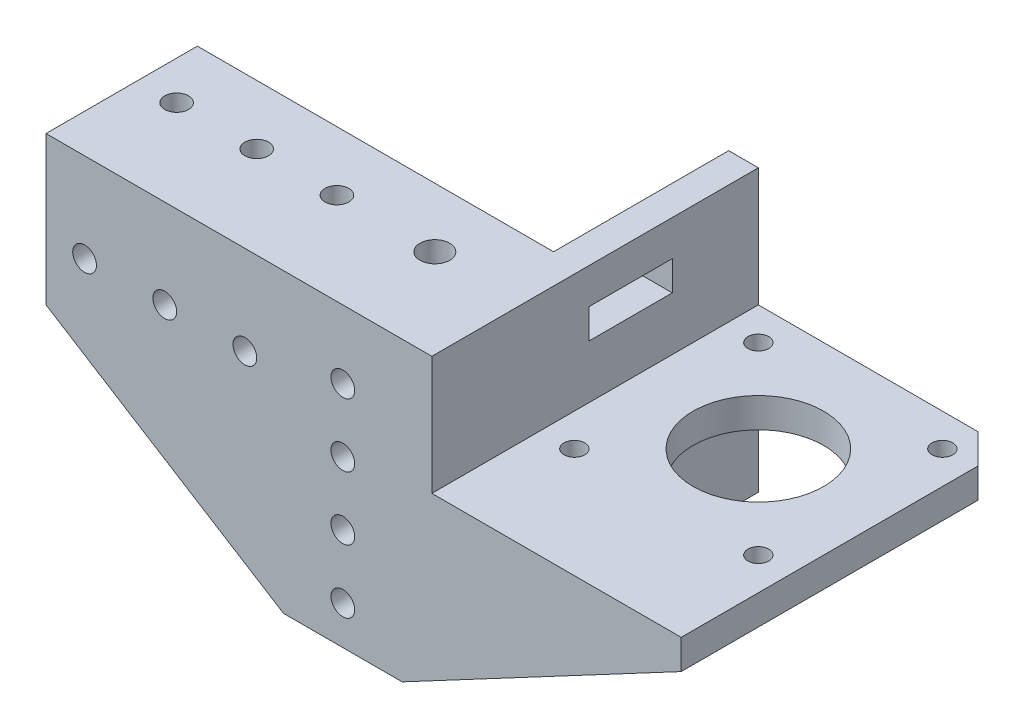
ISO-10303-21;
HEADER;
FILE_DESCRIPTION(('STEP AP214'),'2;1');
FILE_NAME('part.step','',(''),(''),'','','');
FILE_SCHEMA(('AUTOMOTIVE_DESIGN { 1 0 10303 214 1 1 1 1 }'));
ENDSEC;
DATA;
#1=APPLICATION_CONTEXT('core data for automotive mechanical design processes');
#2=APPLICATION_PROTOCOL_DEFINITION('international standard','automotive_design',2000,#1);
#3=PRODUCT_CONTEXT('',#1,'mechanical');
#4=PRODUCT('Part','Part','',(#3));
#5=PRODUCT_RELATED_PRODUCT_CATEGORY('part','',(#4));
#6=PRODUCT_DEFINITION_FORMATION('','',#4);
#7=PRODUCT_DEFINITION_CONTEXT('part definition',#1,'design');
#8=PRODUCT_DEFINITION('design','',#6,#7);
#9=PRODUCT_DEFINITION_SHAPE('','',#8);
#10=(LENGTH_UNIT() NAMED_UNIT(*) SI_UNIT(.MILLI.,.METRE.));
#11=(NAMED_UNIT(*) PLANE_ANGLE_UNIT() SI_UNIT($,.RADIAN.));
#12=(NAMED_UNIT(*) SI_UNIT($,.STERADIAN.) SOLID_ANGLE_UNIT());
#13=UNCERTAINTY_MEASURE_WITH_UNIT(LENGTH_MEASURE(1.E-05),#10,'distance_accuracy_value','');
#14=(GEOMETRIC_REPRESENTATION_CONTEXT(3) GLOBAL_UNCERTAINTY_ASSIGNED_CONTEXT((#13)) GLOBAL_UNIT_ASSIGNED_CONTEXT((#10,
#11,#12)) REPRESENTATION_CONTEXT('',''));
#15=CARTESIAN_POINT('',(0.,0.,0.));
#16=DIRECTION('',(0.,0.,1.));
#17=DIRECTION('',(1.,0.,0.));
#18=AXIS2_PLACEMENT_3D('',#15,#16,#17);
#19=CARTESIAN_POINT('',(0.,25.,0.));
#20=DIRECTION('',(0.,-1.,0.));
#21=DIRECTION('',(0.,0.,-1.));
#22=AXIS2_PLACEMENT_3D('',#19,#20,#21);
#23=PLANE('',#22);
#24=CARTESIAN_POINT('',(10.,25.,-10.));
#25=DIRECTION('',(0.,1.,0.));
#26=DIRECTION('',(0.,0.,1.));
#27=AXIS2_PLACEMENT_3D('',#24,#25,#26);
#28=CIRCLE('',#27,2.5);
#29=CARTESIAN_POINT('',(10.,25.,-7.5));
#30=VERTEX_POINT('',#29);
#31=EDGE_CURVE('E264',#30,#30,#28,.T.);
#32=ORIENTED_EDGE('',*,*,#31,.F.);
#33=EDGE_LOOP('',(#32));
#34=FACE_BOUND('',#33,.T.);
#35=CARTESIAN_POINT('',(-33.5,25.,-10.));
#36=DIRECTION('',(0.,1.,0.));
#37=DIRECTION('',(0.,0.,1.));
#38=AXIS2_PLACEMENT_3D('',#35,#36,#37);
#39=CIRCLE('',#38,2.);
#40=CARTESIAN_POINT('',(-33.5,25.,-7.99999999999999));
#41=VERTEX_POINT('',#40);
#42=EDGE_CURVE('E268',#41,#41,#39,.T.);
#43=ORIENTED_EDGE('',*,*,#42,.F.);
#44=EDGE_LOOP('',(#43));
#45=FACE_BOUND('',#44,.T.);
#46=CARTESIAN_POINT('',(-20.,25.,-10.));
#47=DIRECTION('',(0.,1.,0.));
#48=DIRECTION('',(0.,0.,1.));
#49=AXIS2_PLACEMENT_3D('',#46,#47,#48);
#50=CIRCLE('',#49,2.);
#51=CARTESIAN_POINT('',(-20.,25.,-8.));
#52=VERTEX_POINT('',#51);
#53=EDGE_CURVE('E271',#52,#52,#50,.T.);
#54=ORIENTED_EDGE('',*,*,#53,.F.);
#55=EDGE_LOOP('',(#54));
#56=FACE_BOUND('',#55,.T.);
#57=CARTESIAN_POINT('',(-6.49999999999998,25.,-10.));
#58=DIRECTION('',(0.,1.,0.));
#59=DIRECTION('',(0.,0.,1.));
#60=AXIS2_PLACEMENT_3D('',#57,#58,#59);
#61=CIRCLE('',#60,2.);
#62=CARTESIAN_POINT('',(-6.49999999999998,25.,-8.));
#63=VERTEX_POINT('',#62);
#64=EDGE_CURVE('E263',#63,#63,#61,.T.);
#65=ORIENTED_EDGE('',*,*,#64,.F.);
#66=EDGE_LOOP('',(#65));
#67=FACE_BOUND('',#66,.T.);
#68=DIRECTION('',(0.,0.,1.));
#69=VECTOR('',#68,1.);
#70=CARTESIAN_POINT('',(25.,25.,-49.5));
#71=LINE('',#70,#69);
#72=CARTESIAN_POINT('',(25.,25.,-49.5));
#73=VERTEX_POINT('',#72);
#74=CARTESIAN_POINT('',(25.,25.,5.5));
#75=VERTEX_POINT('',#74);
#76=EDGE_CURVE('E285',#73,#75,#71,.T.);
#77=ORIENTED_EDGE('',*,*,#76,.F.);
#78=DIRECTION('',(-1.,0.,0.));
#79=VECTOR('',#78,1.);
#80=CARTESIAN_POINT('',(30.,25.,-49.5));
#81=LINE('',#80,#79);
#82=CARTESIAN_POINT('',(20.,25.,-49.5));
#83=VERTEX_POINT('',#82);
#84=EDGE_CURVE('E332',#73,#83,#81,.T.);
#85=ORIENTED_EDGE('',*,*,#84,.T.);
#86=DIRECTION('',(0.,0.,-1.));
#87=VECTOR('',#86,1.);
#88=CARTESIAN_POINT('',(20.,25.,-49.5));
#89=LINE('',#88,#87);
#90=CARTESIAN_POINT('',(20.,25.,-20.));
#91=VERTEX_POINT('',#90);
#92=EDGE_CURVE('E288',#91,#83,#89,.T.);
#93=ORIENTED_EDGE('',*,*,#92,.F.);
#94=DIRECTION('',(-1.,0.,0.));
#95=VECTOR('',#94,1.);
#96=CARTESIAN_POINT('',(-40.,25.,-20.));
#97=LINE('',#96,#95);
#98=CARTESIAN_POINT('',(-40.,25.,-20.));
#99=VERTEX_POINT('',#98);
#100=EDGE_CURVE('E344',#91,#99,#97,.T.);
#101=ORIENTED_EDGE('',*,*,#100,.T.);
#102=DIRECTION('',(0.,0.,1.));
#103=VECTOR('',#102,1.);
#104=CARTESIAN_POINT('',(-40.,25.,5.5));
#105=LINE('',#104,#103);
#106=CARTESIAN_POINT('',(-40.,25.,5.5));
#107=VERTEX_POINT('',#106);
#108=EDGE_CURVE('E337',#99,#107,#105,.T.);
#109=ORIENTED_EDGE('',*,*,#108,.T.);
#110=DIRECTION('',(1.,0.,0.));
#111=VECTOR('',#110,1.);
#112=CARTESIAN_POINT('',(-40.,25.,5.5));
#113=LINE('',#112,#111);
#114=EDGE_CURVE('E340',#107,#75,#113,.T.);
#115=ORIENTED_EDGE('',*,*,#114,.T.);
#116=EDGE_LOOP('',(#77,#85,#93,#101,#109,#115));
#117=FACE_BOUND('',#116,.T.);
#118=ADVANCED_FACE('F34',(#34,#45,#56,#67,#117),#23,.F.);
#119=CARTESIAN_POINT('',(-40.,25.,-20.));
#120=DIRECTION('',(0.,0.,1.));
#121=DIRECTION('',(1.,0.,0.));
#122=AXIS2_PLACEMENT_3D('',#119,#120,#121);
#123=PLANE('',#122);
#124=DIRECTION('',(0.,-1.,0.));
#125=VECTOR('',#124,1.);
#126=CARTESIAN_POINT('',(20.,54.9207286007544,-20.));
#127=LINE('',#126,#125);
#128=CARTESIAN_POINT('',(20.,20.,-20.));
#129=VERTEX_POINT('',#128);
#130=EDGE_CURVE('E287',#91,#129,#127,.T.);
#131=ORIENTED_EDGE('',*,*,#130,.T.);
#132=DIRECTION('',(-1.,0.,0.));
#133=VECTOR('',#132,1.);
#134=CARTESIAN_POINT('',(-40.,20.,-20.));
#135=LINE('',#134,#133);
#136=CARTESIAN_POINT('',(-40.,20.,-20.));
#137=VERTEX_POINT('',#136);
#138=EDGE_CURVE('E341',#129,#137,#135,.T.);
#139=ORIENTED_EDGE('',*,*,#138,.T.);
#140=DIRECTION('',(0.,-1.,0.));
#141=VECTOR('',#140,1.);
#142=CARTESIAN_POINT('',(-40.,25.,-20.));
#143=LINE('',#142,#141);
#144=EDGE_CURVE('E346',#99,#137,#143,.T.);
#145=ORIENTED_EDGE('',*,*,#144,.F.);
#146=ORIENTED_EDGE('',*,*,#100,.F.);
#147=EDGE_LOOP('',(#131,#139,#145,#146));
#148=FACE_BOUND('',#147,.T.);
#149=ADVANCED_FACE('F480',(#148),#123,.F.);
#150=CARTESIAN_POINT('',(0.,20.,0.));
#151=DIRECTION('',(0.,-1.,0.));
#152=DIRECTION('',(0.,0.,-1.));
#153=AXIS2_PLACEMENT_3D('',#150,#151,#152);
#154=PLANE('',#153);
#155=CARTESIAN_POINT('',(10.,20.,-10.));
#156=DIRECTION('',(0.,-1.,0.));
#157=DIRECTION('',(0.,0.,-1.));
#158=AXIS2_PLACEMENT_3D('',#155,#156,#157);
#159=CIRCLE('',#158,2.5);
#160=CARTESIAN_POINT('',(10.,20.,-12.5));
#161=VERTEX_POINT('',#160);
#162=EDGE_CURVE('E280',#161,#161,#159,.T.);
#163=ORIENTED_EDGE('',*,*,#162,.F.);
#164=EDGE_LOOP('',(#163));
#165=FACE_BOUND('',#164,.T.);
#166=CARTESIAN_POINT('',(-33.5,20.,-10.));
#167=DIRECTION('',(0.,-1.,0.));
#168=DIRECTION('',(0.,0.,-1.));
#169=AXIS2_PLACEMENT_3D('',#166,#167,#168);
#170=CIRCLE('',#169,2.);
#171=CARTESIAN_POINT('',(-33.5,20.,-12.));
#172=VERTEX_POINT('',#171);
#173=EDGE_CURVE('E390',#172,#172,#170,.T.);
#174=ORIENTED_EDGE('',*,*,#173,.F.);
#175=EDGE_LOOP('',(#174));
#176=FACE_BOUND('',#175,.T.);
#177=CARTESIAN_POINT('',(-20.,20.,-10.));
#178=DIRECTION('',(0.,-1.,0.));
#179=DIRECTION('',(0.,0.,-1.));
#180=AXIS2_PLACEMENT_3D('',#177,#178,#179);
#181=CIRCLE('',#180,2.);
#182=CARTESIAN_POINT('',(-20.,20.,-12.));
#183=VERTEX_POINT('',#182);
#184=EDGE_CURVE('E387',#183,#183,#181,.T.);
#185=ORIENTED_EDGE('',*,*,#184,.F.);
#186=EDGE_LOOP('',(#185));
#187=FACE_BOUND('',#186,.T.);
#188=CARTESIAN_POINT('',(-6.49999999999998,20.,-10.));
#189=DIRECTION('',(0.,-1.,0.));
#190=DIRECTION('',(0.,0.,-1.));
#191=AXIS2_PLACEMENT_3D('',#188,#189,#190);
#192=CIRCLE('',#191,2.);
#193=CARTESIAN_POINT('',(-6.49999999999998,20.,-12.));
#194=VERTEX_POINT('',#193);
#195=EDGE_CURVE('E267',#194,#194,#192,.T.);
#196=ORIENTED_EDGE('',*,*,#195,.F.);
#197=EDGE_LOOP('',(#196));
#198=FACE_BOUND('',#197,.T.);
#199=ORIENTED_EDGE('',*,*,#138,.F.);
#200=DIRECTION('',(0.,0.,1.));
#201=VECTOR('',#200,1.);
#202=CARTESIAN_POINT('',(20.,20.,-7.5));
#203=LINE('',#202,#201);
#204=CARTESIAN_POINT('',(20.,20.,0.));
#205=VERTEX_POINT('',#204);
#206=EDGE_CURVE('E310',#129,#205,#203,.T.);
#207=ORIENTED_EDGE('',*,*,#206,.T.);
#208=DIRECTION('',(1.,0.,0.));
#209=VECTOR('',#208,1.);
#210=CARTESIAN_POINT('',(0.,20.,0.));
#211=LINE('',#210,#209);
#212=CARTESIAN_POINT('',(-40.,20.,0.));
#213=VERTEX_POINT('',#212);
#214=EDGE_CURVE('E366',#213,#205,#211,.T.);
#215=ORIENTED_EDGE('',*,*,#214,.F.);
#216=DIRECTION('',(0.,0.,1.));
#217=VECTOR('',#216,1.);
#218=CARTESIAN_POINT('',(-40.,20.,5.5));
#219=LINE('',#218,#217);
#220=EDGE_CURVE('E336',#137,#213,#219,.T.);
#221=ORIENTED_EDGE('',*,*,#220,.F.);
#222=EDGE_LOOP('',(#199,#207,#215,#221));
#223=FACE_BOUND('',#222,.T.);
#224=ADVANCED_FACE('F472',(#165,#176,#187,#198,#223),#154,.T.);
#225=CARTESIAN_POINT('',(0.,0.,-7.5));
#226=DIRECTION('',(0.,0.,-1.));
#227=DIRECTION('',(-1.,0.,0.));
#228=AXIS2_PLACEMENT_3D('',#225,#226,#227);
#229=PLANE('',#228);
#230=DIRECTION('',(-0.88287238919928,-0.46961297297834,0.));
#231=VECTOR('',#230,1.);
#232=CARTESIAN_POINT('',(67.,0.,-7.5));
#233=LINE('',#232,#231);
#234=CARTESIAN_POINT('',(67.,0.,-7.5));
#235=VERTEX_POINT('',#234);
#236=CARTESIAN_POINT('',(25.,-22.3404255319149,-7.5));
#237=VERTEX_POINT('',#236);
#238=EDGE_CURVE('E305',#235,#237,#233,.T.);
#239=ORIENTED_EDGE('',*,*,#238,.T.);
#240=DIRECTION('',(0.,1.,0.));
#241=VECTOR('',#240,1.);
#242=CARTESIAN_POINT('',(25.,0.,-7.5));
#243=LINE('',#242,#241);
#244=CARTESIAN_POINT('',(25.,0.,-7.5));
#245=VERTEX_POINT('',#244);
#246=EDGE_CURVE('E382',#237,#245,#243,.T.);
#247=ORIENTED_EDGE('',*,*,#246,.T.);
#248=DIRECTION('',(1.,0.,0.));
#249=VECTOR('',#248,1.);
#250=CARTESIAN_POINT('',(25.,0.,-7.5));
#251=LINE('',#250,#249);
#252=EDGE_CURVE('E307',#245,#235,#251,.T.);
#253=ORIENTED_EDGE('',*,*,#252,.T.);
#254=EDGE_LOOP('',(#239,#247,#253));
#255=FACE_BOUND('',#254,.T.);
#256=ADVANCED_FACE('F469',(#255),#229,.T.);
#257=CARTESIAN_POINT('',(0.,0.,0.));
#258=DIRECTION('',(0.,0.,1.));
#259=DIRECTION('',(1.,0.,0.));
#260=AXIS2_PLACEMENT_3D('',#257,#258,#259);
#261=PLANE('',#260);
#262=CARTESIAN_POINT('',(-33.5,10.,0.));
#263=DIRECTION('',(0.,0.,1.));
#264=DIRECTION('',(1.,0.,0.));
#265=AXIS2_PLACEMENT_3D('',#262,#263,#264);
#266=CIRCLE('',#265,2.);
#267=CARTESIAN_POINT('',(-31.5,10.,0.));
#268=VERTEX_POINT('',#267);
#269=EDGE_CURVE('E260',#268,#268,#266,.T.);
#270=ORIENTED_EDGE('',*,*,#269,.T.);
#271=EDGE_LOOP('',(#270));
#272=FACE_BOUND('',#271,.T.);
#273=CARTESIAN_POINT('',(10.,13.5,0.));
#274=DIRECTION('',(0.,0.,1.));
#275=DIRECTION('',(1.,0.,0.));
#276=AXIS2_PLACEMENT_3D('',#273,#274,#275);
#277=CIRCLE('',#276,2.);
#278=CARTESIAN_POINT('',(12.,13.5,0.));
#279=VERTEX_POINT('',#278);
#280=EDGE_CURVE('E257',#279,#279,#277,.T.);
#281=ORIENTED_EDGE('',*,*,#280,.T.);
#282=EDGE_LOOP('',(#281));
#283=FACE_BOUND('',#282,.T.);
#284=CARTESIAN_POINT('',(10.,-18.5,0.));
#285=DIRECTION('',(0.,0.,1.));
#286=DIRECTION('',(1.,0.,0.));
#287=AXIS2_PLACEMENT_3D('',#284,#285,#286);
#288=CIRCLE('',#287,2.);
#289=CARTESIAN_POINT('',(12.,-18.5,0.));
#290=VERTEX_POINT('',#289);
#291=EDGE_CURVE('E254',#290,#290,#288,.T.);
#292=ORIENTED_EDGE('',*,*,#291,.T.);
#293=EDGE_LOOP('',(#292));
#294=FACE_BOUND('',#293,.T.);
#295=CARTESIAN_POINT('',(9.99999999999993,2.83333333333334,0.));
#296=DIRECTION('',(0.,0.,1.));
#297=DIRECTION('',(1.,0.,0.));
#298=AXIS2_PLACEMENT_3D('',#295,#296,#297);
#299=CIRCLE('',#298,2.);
#300=CARTESIAN_POINT('',(11.9999999999999,2.83333333333334,0.));
#301=VERTEX_POINT('',#300);
#302=EDGE_CURVE('E251',#301,#301,#299,.T.);
#303=ORIENTED_EDGE('',*,*,#302,.T.);
#304=EDGE_LOOP('',(#303));
#305=FACE_BOUND('',#304,.T.);
#306=CARTESIAN_POINT('',(9.99999999999996,-7.83333333333332,0.));
#307=DIRECTION('',(0.,0.,1.));
#308=DIRECTION('',(1.,0.,0.));
#309=AXIS2_PLACEMENT_3D('',#306,#307,#308);
#310=CIRCLE('',#309,2.);
#311=CARTESIAN_POINT('',(12.,-7.83333333333332,0.));
#312=VERTEX_POINT('',#311);
#313=EDGE_CURVE('E248',#312,#312,#310,.T.);
#314=ORIENTED_EDGE('',*,*,#313,.T.);
#315=EDGE_LOOP('',(#314));
#316=FACE_BOUND('',#315,.T.);
#317=CARTESIAN_POINT('',(-6.5,10.,0.));
#318=DIRECTION('',(0.,0.,1.));
#319=DIRECTION('',(1.,0.,0.));
#320=AXIS2_PLACEMENT_3D('',#317,#318,#319);
#321=CIRCLE('',#320,2.);
#322=CARTESIAN_POINT('',(-4.5,10.,0.));
#323=VERTEX_POINT('',#322);
#324=EDGE_CURVE('E245',#323,#323,#321,.T.);
#325=ORIENTED_EDGE('',*,*,#324,.T.);
#326=EDGE_LOOP('',(#325));
#327=FACE_BOUND('',#326,.T.);
#328=CARTESIAN_POINT('',(-20.,10.,0.));
#329=DIRECTION('',(0.,0.,1.));
#330=DIRECTION('',(1.,0.,0.));
#331=AXIS2_PLACEMENT_3D('',#328,#329,#330);
#332=CIRCLE('',#331,2.);
#333=CARTESIAN_POINT('',(-18.,10.,0.));
#334=VERTEX_POINT('',#333);
#335=EDGE_CURVE('E225',#334,#334,#332,.T.);
#336=ORIENTED_EDGE('',*,*,#335,.T.);
#337=EDGE_LOOP('',(#336));
#338=FACE_BOUND('',#337,.T.);
#339=DIRECTION('',(0.,1.,0.));
#340=VECTOR('',#339,1.);
#341=CARTESIAN_POINT('',(20.,-25.,0.));
#342=LINE('',#341,#340);
#343=CARTESIAN_POINT('',(20.,-25.,0.));
#344=VERTEX_POINT('',#343);
#345=EDGE_CURVE('E300',#344,#205,#342,.T.);
#346=ORIENTED_EDGE('',*,*,#345,.F.);
#347=DIRECTION('',(1.,0.,0.));
#348=VECTOR('',#347,1.);
#349=CARTESIAN_POINT('',(0.,-25.,0.));
#350=LINE('',#349,#348);
#351=CARTESIAN_POINT('',(0.,-25.,0.));
#352=VERTEX_POINT('',#351);
#353=EDGE_CURVE('E352',#352,#344,#350,.T.);
#354=ORIENTED_EDGE('',*,*,#353,.F.);
#355=DIRECTION('',(0.847998304005088,-0.52999894000318,0.));
#356=VECTOR('',#355,1.);
#357=CARTESIAN_POINT('',(-11.2359550561798,-17.9775280898876,0.));
#358=LINE('',#357,#356);
#359=CARTESIAN_POINT('',(-40.,0.,0.));
#360=VERTEX_POINT('',#359);
#361=EDGE_CURVE('E357',#360,#352,#358,.T.);
#362=ORIENTED_EDGE('',*,*,#361,.F.);
#363=DIRECTION('',(0.,-1.,0.));
#364=VECTOR('',#363,1.);
#365=CARTESIAN_POINT('',(-40.,0.,0.));
#366=LINE('',#365,#364);
#367=EDGE_CURVE('E369',#213,#360,#366,.T.);
#368=ORIENTED_EDGE('',*,*,#367,.F.);
#369=ORIENTED_EDGE('',*,*,#214,.T.);
#370=EDGE_LOOP('',(#346,#354,#362,#368,#369));
#371=FACE_BOUND('',#370,.T.);
#372=ADVANCED_FACE('F471',(#272,#283,#294,#305,#316,#327,#338,#371),#261,.F.);
#373=CARTESIAN_POINT('',(0.,-25.,5.5));
#374=DIRECTION('',(0.,1.,0.));
#375=DIRECTION('',(-1.,0.,0.));
#376=AXIS2_PLACEMENT_3D('',#373,#374,#375);
#377=PLANE('',#376);
#378=ORIENTED_EDGE('',*,*,#353,.T.);
#379=DIRECTION('',(0.,0.,-1.));
#380=VECTOR('',#379,1.);
#381=CARTESIAN_POINT('',(20.,-25.,5.5));
#382=LINE('',#381,#380);
#383=CARTESIAN_POINT('',(20.,-25.,5.5));
#384=VERTEX_POINT('',#383);
#385=EDGE_CURVE('E379',#384,#344,#382,.T.);
#386=ORIENTED_EDGE('',*,*,#385,.F.);
#387=DIRECTION('',(1.,0.,0.));
#388=VECTOR('',#387,1.);
#389=CARTESIAN_POINT('',(0.,-25.,5.5));
#390=LINE('',#389,#388);
#391=CARTESIAN_POINT('',(0.,-25.,5.5));
#392=VERTEX_POINT('',#391);
#393=EDGE_CURVE('E353',#392,#384,#390,.T.);
#394=ORIENTED_EDGE('',*,*,#393,.F.);
#395=DIRECTION('',(0.,0.,-1.));
#396=VECTOR('',#395,1.);
#397=CARTESIAN_POINT('',(0.,-25.,5.5));
#398=LINE('',#397,#396);
#399=EDGE_CURVE('E363',#392,#352,#398,.T.);
#400=ORIENTED_EDGE('',*,*,#399,.T.);
#401=EDGE_LOOP('',(#378,#386,#394,#400));
#402=FACE_BOUND('',#401,.T.);
#403=ADVANCED_FACE('F464',(#402),#377,.F.);
#404=CARTESIAN_POINT('',(14.7759350741002,-27.7787579393084,5.5));
#405=DIRECTION('',(-0.46961297297834,0.88287238919928,0.));
#406=DIRECTION('',(-0.88287238919928,-0.46961297297834,0.));
#407=AXIS2_PLACEMENT_3D('',#404,#405,#406);
#408=PLANE('',#407);
#409=ORIENTED_EDGE('',*,*,#385,.T.);
#410=DIRECTION('',(0.,0.,1.));
#411=VECTOR('',#410,1.);
#412=CARTESIAN_POINT('',(20.,-25.,-7.5));
#413=LINE('',#412,#411);
#414=CARTESIAN_POINT('',(20.,-25.,-49.5));
#415=VERTEX_POINT('',#414);
#416=EDGE_CURVE('E314',#415,#344,#413,.T.);
#417=ORIENTED_EDGE('',*,*,#416,.F.);
#418=DIRECTION('',(0.88287238919928,0.46961297297834,0.));
#419=VECTOR('',#418,1.);
#420=CARTESIAN_POINT('',(25.,-22.3404255319149,-49.5));
#421=LINE('',#420,#419);
#422=CARTESIAN_POINT('',(25.,-22.3404255319149,-49.5));
#423=VERTEX_POINT('',#422);
#424=EDGE_CURVE('E297',#415,#423,#421,.T.);
#425=ORIENTED_EDGE('',*,*,#424,.T.);
#426=DIRECTION('',(0.,0.,1.));
#427=VECTOR('',#426,1.);
#428=CARTESIAN_POINT('',(25.,-22.3404255319149,-94.7769256906871));
#429=LINE('',#428,#427);
#430=EDGE_CURVE('E291',#423,#237,#429,.T.);
#431=ORIENTED_EDGE('',*,*,#430,.T.);
#432=ORIENTED_EDGE('',*,*,#238,.F.);
#433=DIRECTION('',(0.,0.,-1.));
#434=VECTOR('',#433,1.);
#435=CARTESIAN_POINT('',(67.,0.,5.5));
#436=LINE('',#435,#434);
#437=CARTESIAN_POINT('',(67.,0.,5.5));
#438=VERTEX_POINT('',#437);
#439=EDGE_CURVE('E377',#438,#235,#436,.T.);
#440=ORIENTED_EDGE('',*,*,#439,.F.);
#441=DIRECTION('',(0.88287238919928,0.46961297297834,0.));
#442=VECTOR('',#441,1.);
#443=CARTESIAN_POINT('',(14.7759350741002,-27.7787579393084,5.5));
#444=LINE('',#443,#442);
#445=EDGE_CURVE('E356',#384,#438,#444,.T.);
#446=ORIENTED_EDGE('',*,*,#445,.F.);
#447=EDGE_LOOP('',(#409,#417,#425,#431,#432,#440,#446));
#448=FACE_BOUND('',#447,.T.);
#449=ADVANCED_FACE('F465',(#448),#408,.F.);
#450=CARTESIAN_POINT('',(-40.,0.,5.5));
#451=DIRECTION('',(1.,0.,0.));
#452=DIRECTION('',(0.,1.,0.));
#453=AXIS2_PLACEMENT_3D('',#450,#451,#452);
#454=PLANE('',#453);
#455=ORIENTED_EDGE('',*,*,#367,.T.);
#456=DIRECTION('',(0.,0.,-1.));
#457=VECTOR('',#456,1.);
#458=CARTESIAN_POINT('',(-40.,0.,5.5));
#459=LINE('',#458,#457);
#460=CARTESIAN_POINT('',(-40.,0.,5.5));
#461=VERTEX_POINT('',#460);
#462=EDGE_CURVE('E374',#461,#360,#459,.T.);
#463=ORIENTED_EDGE('',*,*,#462,.F.);
#464=DIRECTION('',(0.,-1.,0.));
#465=VECTOR('',#464,1.);
#466=CARTESIAN_POINT('',(-40.,0.,5.5));
#467=LINE('',#466,#465);
#468=EDGE_CURVE('E359',#107,#461,#467,.T.);
#469=ORIENTED_EDGE('',*,*,#468,.F.);
#470=ORIENTED_EDGE('',*,*,#108,.F.);
#471=ORIENTED_EDGE('',*,*,#144,.T.);
#472=ORIENTED_EDGE('',*,*,#220,.T.);
#473=EDGE_LOOP('',(#455,#463,#469,#470,#471,#472));
#474=FACE_BOUND('',#473,.T.);
#475=ADVANCED_FACE('F452',(#474),#454,.F.);
#476=CARTESIAN_POINT('',(-11.2359550561798,-17.9775280898876,5.5));
#477=DIRECTION('',(0.52999894000318,0.847998304005088,0.));
#478=DIRECTION('',(-0.847998304005088,0.52999894000318,0.));
#479=AXIS2_PLACEMENT_3D('',#476,#477,#478);
#480=PLANE('',#479);
#481=ORIENTED_EDGE('',*,*,#361,.T.);
#482=ORIENTED_EDGE('',*,*,#399,.F.);
#483=DIRECTION('',(0.847998304005088,-0.52999894000318,0.));
#484=VECTOR('',#483,1.);
#485=CARTESIAN_POINT('',(-11.2359550561798,-17.9775280898876,5.5));
#486=LINE('',#485,#484);
#487=EDGE_CURVE('E361',#461,#392,#486,.T.);
#488=ORIENTED_EDGE('',*,*,#487,.F.);
#489=ORIENTED_EDGE('',*,*,#462,.T.);
#490=EDGE_LOOP('',(#481,#482,#488,#489));
#491=FACE_BOUND('',#490,.T.);
#492=ADVANCED_FACE('F460',(#491),#480,.F.);
#493=CARTESIAN_POINT('',(0.,0.,5.5));
#494=DIRECTION('',(0.,0.,1.));
#495=DIRECTION('',(1.,0.,0.));
#496=AXIS2_PLACEMENT_3D('',#493,#494,#495);
#497=PLANE('',#496);
#498=CARTESIAN_POINT('',(-33.5,10.,5.5));
#499=DIRECTION('',(0.,0.,1.));
#500=DIRECTION('',(1.,0.,0.));
#501=AXIS2_PLACEMENT_3D('',#498,#499,#500);
#502=CIRCLE('',#501,2.);
#503=CARTESIAN_POINT('',(-31.5,10.,5.5));
#504=VERTEX_POINT('',#503);
#505=EDGE_CURVE('E222',#504,#504,#502,.T.);
#506=ORIENTED_EDGE('',*,*,#505,.F.);
#507=EDGE_LOOP('',(#506));
#508=FACE_BOUND('',#507,.T.);
#509=CARTESIAN_POINT('',(10.,13.5,5.5));
#510=DIRECTION('',(0.,0.,1.));
#511=DIRECTION('',(1.,0.,0.));
#512=AXIS2_PLACEMENT_3D('',#509,#510,#511);
#513=CIRCLE('',#512,2.);
#514=CARTESIAN_POINT('',(12.,13.5,5.5));
#515=VERTEX_POINT('',#514);
#516=EDGE_CURVE('E221',#515,#515,#513,.T.);
#517=ORIENTED_EDGE('',*,*,#516,.F.);
#518=EDGE_LOOP('',(#517));
#519=FACE_BOUND('',#518,.T.);
#520=CARTESIAN_POINT('',(10.,-18.5,5.5));
#521=DIRECTION('',(0.,0.,1.));
#522=DIRECTION('',(1.,0.,0.));
#523=AXIS2_PLACEMENT_3D('',#520,#521,#522);
#524=CIRCLE('',#523,2.);
#525=CARTESIAN_POINT('',(12.,-18.5,5.5));
#526=VERTEX_POINT('',#525);
#527=EDGE_CURVE('E227',#526,#526,#524,.T.);
#528=ORIENTED_EDGE('',*,*,#527,.F.);
#529=EDGE_LOOP('',(#528));
#530=FACE_BOUND('',#529,.T.);
#531=CARTESIAN_POINT('',(9.99999999999993,2.83333333333334,5.5));
#532=DIRECTION('',(0.,0.,1.));
#533=DIRECTION('',(1.,0.,0.));
#534=AXIS2_PLACEMENT_3D('',#531,#532,#533);
#535=CIRCLE('',#534,2.);
#536=CARTESIAN_POINT('',(11.9999999999999,2.83333333333334,5.5));
#537=VERTEX_POINT('',#536);
#538=EDGE_CURVE('E230',#537,#537,#535,.T.);
#539=ORIENTED_EDGE('',*,*,#538,.F.);
#540=EDGE_LOOP('',(#539));
#541=FACE_BOUND('',#540,.T.);
#542=CARTESIAN_POINT('',(9.99999999999996,-7.83333333333332,5.5));
#543=DIRECTION('',(0.,0.,1.));
#544=DIRECTION('',(1.,0.,0.));
#545=AXIS2_PLACEMENT_3D('',#542,#543,#544);
#546=CIRCLE('',#545,2.);
#547=CARTESIAN_POINT('',(12.,-7.83333333333332,5.5));
#548=VERTEX_POINT('',#547);
#549=EDGE_CURVE('E238',#548,#548,#546,.T.);
#550=ORIENTED_EDGE('',*,*,#549,.F.);
#551=EDGE_LOOP('',(#550));
#552=FACE_BOUND('',#551,.T.);
#553=CARTESIAN_POINT('',(-6.5,10.,5.5));
#554=DIRECTION('',(0.,0.,1.));
#555=DIRECTION('',(1.,0.,0.));
#556=AXIS2_PLACEMENT_3D('',#553,#554,#555);
#557=CIRCLE('',#556,2.);
#558=CARTESIAN_POINT('',(-4.5,10.,5.5));
#559=VERTEX_POINT('',#558);
#560=EDGE_CURVE('E235',#559,#559,#557,.T.);
#561=ORIENTED_EDGE('',*,*,#560,.F.);
#562=EDGE_LOOP('',(#561));
#563=FACE_BOUND('',#562,.T.);
#564=CARTESIAN_POINT('',(-20.,10.,5.5));
#565=DIRECTION('',(0.,0.,1.));
#566=DIRECTION('',(1.,0.,0.));
#567=AXIS2_PLACEMENT_3D('',#564,#565,#566);
#568=CIRCLE('',#567,2.);
#569=CARTESIAN_POINT('',(-18.,10.,5.5));
#570=VERTEX_POINT('',#569);
#571=EDGE_CURVE('E226',#570,#570,#568,.T.);
#572=ORIENTED_EDGE('',*,*,#571,.F.);
#573=EDGE_LOOP('',(#572));
#574=FACE_BOUND('',#573,.T.);
#575=DIRECTION('',(1.,0.,0.));
#576=VECTOR('',#575,1.);
#577=CARTESIAN_POINT('',(67.,5.,5.5));
#578=LINE('',#577,#576);
#579=CARTESIAN_POINT('',(25.,5.,5.5));
#580=VERTEX_POINT('',#579);
#581=CARTESIAN_POINT('',(67.,5.,5.5));
#582=VERTEX_POINT('',#581);
#583=EDGE_CURVE('E322',#580,#582,#578,.T.);
#584=ORIENTED_EDGE('',*,*,#583,.F.);
#585=DIRECTION('',(0.,-1.,0.));
#586=VECTOR('',#585,1.);
#587=CARTESIAN_POINT('',(25.,25.,5.5));
#588=LINE('',#587,#586);
#589=EDGE_CURVE('E276',#75,#580,#588,.T.);
#590=ORIENTED_EDGE('',*,*,#589,.F.);
#591=ORIENTED_EDGE('',*,*,#114,.F.);
#592=ORIENTED_EDGE('',*,*,#468,.T.);
#593=ORIENTED_EDGE('',*,*,#487,.T.);
#594=ORIENTED_EDGE('',*,*,#393,.T.);
#595=ORIENTED_EDGE('',*,*,#445,.T.);
#596=DIRECTION('',(0.,-1.,0.));
#597=VECTOR('',#596,1.);
#598=CARTESIAN_POINT('',(67.,5.,5.5));
#599=LINE('',#598,#597);
#600=EDGE_CURVE('E324',#582,#438,#599,.T.);
#601=ORIENTED_EDGE('',*,*,#600,.F.);
#602=EDGE_LOOP('',(#584,#590,#591,#592,#593,#594,#595,#601));
#603=FACE_BOUND('',#602,.T.);
#604=ADVANCED_FACE('F449',(#508,#519,#530,#541,#552,#563,#574,#603),#497,.T.);
#605=CARTESIAN_POINT('',(30.,0.,5.5));
#606=DIRECTION('',(0.,1.,0.));
#607=DIRECTION('',(-1.,0.,0.));
#608=AXIS2_PLACEMENT_3D('',#605,#606,#607);
#609=PLANE('',#608);
#610=CARTESIAN_POINT('',(46.,0.,-28.5));
#611=DIRECTION('',(0.,1.,0.));
#612=DIRECTION('',(-1.,0.,0.));
#613=AXIS2_PLACEMENT_3D('',#610,#611,#612);
#614=CIRCLE('',#613,11.);
#615=CARTESIAN_POINT('',(35.,0.,-28.5));
#616=VERTEX_POINT('',#615);
#617=EDGE_CURVE('E218',#616,#616,#614,.T.);
#618=ORIENTED_EDGE('',*,*,#617,.T.);
#619=EDGE_LOOP('',(#618));
#620=FACE_BOUND('',#619,.T.);
#621=CARTESIAN_POINT('',(30.5,0.,-44.));
#622=DIRECTION('',(0.,1.,0.));
#623=DIRECTION('',(-1.,0.,0.));
#624=AXIS2_PLACEMENT_3D('',#621,#622,#623);
#625=CIRCLE('',#624,1.75);
#626=CARTESIAN_POINT('',(28.75,0.,-44.));
#627=VERTEX_POINT('',#626);
#628=EDGE_CURVE('E214',#627,#627,#625,.T.);
#629=ORIENTED_EDGE('',*,*,#628,.T.);
#630=EDGE_LOOP('',(#629));
#631=FACE_BOUND('',#630,.T.);
#632=CARTESIAN_POINT('',(30.5,0.,-13.));
#633=DIRECTION('',(0.,1.,0.));
#634=DIRECTION('',(-1.,0.,0.));
#635=AXIS2_PLACEMENT_3D('',#632,#633,#634);
#636=CIRCLE('',#635,1.75);
#637=CARTESIAN_POINT('',(28.75,0.,-13.));
#638=VERTEX_POINT('',#637);
#639=EDGE_CURVE('E210',#638,#638,#636,.T.);
#640=ORIENTED_EDGE('',*,*,#639,.T.);
#641=EDGE_LOOP('',(#640));
#642=FACE_BOUND('',#641,.T.);
#643=CARTESIAN_POINT('',(61.5,0.,-13.));
#644=DIRECTION('',(0.,1.,0.));
#645=DIRECTION('',(-1.,0.,0.));
#646=AXIS2_PLACEMENT_3D('',#643,#644,#645);
#647=CIRCLE('',#646,1.74999999999999);
#648=CARTESIAN_POINT('',(59.75,0.,-13.));
#649=VERTEX_POINT('',#648);
#650=EDGE_CURVE('E206',#649,#649,#647,.T.);
#651=ORIENTED_EDGE('',*,*,#650,.T.);
#652=EDGE_LOOP('',(#651));
#653=FACE_BOUND('',#652,.T.);
#654=CARTESIAN_POINT('',(61.5,0.,-44.));
#655=DIRECTION('',(0.,1.,0.));
#656=DIRECTION('',(-1.,0.,0.));
#657=AXIS2_PLACEMENT_3D('',#654,#655,#656);
#658=CIRCLE('',#657,1.74999999999999);
#659=CARTESIAN_POINT('',(59.75,0.,-44.));
#660=VERTEX_POINT('',#659);
#661=EDGE_CURVE('E202',#660,#660,#658,.T.);
#662=ORIENTED_EDGE('',*,*,#661,.T.);
#663=EDGE_LOOP('',(#662));
#664=FACE_BOUND('',#663,.T.);
#665=DIRECTION('',(-1.,0.,0.));
#666=VECTOR('',#665,1.);
#667=CARTESIAN_POINT('',(30.,0.,-49.5));
#668=LINE('',#667,#666);
#669=CARTESIAN_POINT('',(62.,0.,-49.5));
#670=VERTEX_POINT('',#669);
#671=CARTESIAN_POINT('',(25.,0.,-49.5));
#672=VERTEX_POINT('',#671);
#673=EDGE_CURVE('E334',#670,#672,#668,.T.);
#674=ORIENTED_EDGE('',*,*,#673,.F.);
#675=DIRECTION('',(-0.707106781186548,0.,-0.707106781186548));
#676=VECTOR('',#675,1.);
#677=CARTESIAN_POINT('',(62.,0.,-49.5));
#678=LINE('',#677,#676);
#679=CARTESIAN_POINT('',(67.,0.,-44.5));
#680=VERTEX_POINT('',#679);
#681=EDGE_CURVE('E407',#670,#680,#678,.F.);
#682=ORIENTED_EDGE('',*,*,#681,.T.);
#683=DIRECTION('',(0.,0.,-1.));
#684=VECTOR('',#683,1.);
#685=CARTESIAN_POINT('',(67.,0.,5.5));
#686=LINE('',#685,#684);
#687=EDGE_CURVE('E316',#235,#680,#686,.T.);
#688=ORIENTED_EDGE('',*,*,#687,.F.);
#689=ORIENTED_EDGE('',*,*,#252,.F.);
#690=DIRECTION('',(0.,0.,-1.));
#691=VECTOR('',#690,1.);
#692=CARTESIAN_POINT('',(25.,0.,5.5));
#693=LINE('',#692,#691);
#694=EDGE_CURVE('E329',#245,#672,#693,.T.);
#695=ORIENTED_EDGE('',*,*,#694,.T.);
#696=EDGE_LOOP('',(#674,#682,#688,#689,#695));
#697=FACE_BOUND('',#696,.T.);
#698=ADVANCED_FACE('F426',(#620,#631,#642,#653,#664,#697),#609,.F.);
#699=CARTESIAN_POINT('',(30.,25.,-49.5));
#700=DIRECTION('',(0.,0.,1.));
#701=DIRECTION('',(1.,0.,0.));
#702=AXIS2_PLACEMENT_3D('',#699,#700,#701);
#703=PLANE('',#702);
#704=DIRECTION('',(-1.,0.,0.));
#705=VECTOR('',#704,1.);
#706=CARTESIAN_POINT('',(67.,5.,-49.5));
#707=LINE('',#706,#705);
#708=CARTESIAN_POINT('',(62.,5.,-49.5));
#709=VERTEX_POINT('',#708);
#710=CARTESIAN_POINT('',(25.,5.,-49.5));
#711=VERTEX_POINT('',#710);
#712=EDGE_CURVE('E320',#709,#711,#707,.T.);
#713=ORIENTED_EDGE('',*,*,#712,.F.);
#714=DIRECTION('',(0.,-1.,0.));
#715=VECTOR('',#714,1.);
#716=CARTESIAN_POINT('',(62.,25.,-49.5));
#717=LINE('',#716,#715);
#718=EDGE_CURVE('E384',#709,#670,#717,.T.);
#719=ORIENTED_EDGE('',*,*,#718,.T.);
#720=ORIENTED_EDGE('',*,*,#673,.T.);
#721=DIRECTION('',(0.,1.,0.));
#722=VECTOR('',#721,1.);
#723=CARTESIAN_POINT('',(25.,0.,-49.5));
#724=LINE('',#723,#722);
#725=EDGE_CURVE('E293',#423,#672,#724,.T.);
#726=ORIENTED_EDGE('',*,*,#725,.F.);
#727=ORIENTED_EDGE('',*,*,#424,.F.);
#728=DIRECTION('',(0.,-1.,0.));
#729=VECTOR('',#728,1.);
#730=CARTESIAN_POINT('',(20.,-25.,-49.5));
#731=LINE('',#730,#729);
#732=EDGE_CURVE('E296',#83,#415,#731,.T.);
#733=ORIENTED_EDGE('',*,*,#732,.F.);
#734=ORIENTED_EDGE('',*,*,#84,.F.);
#735=DIRECTION('',(0.,1.,0.));
#736=VECTOR('',#735,1.);
#737=CARTESIAN_POINT('',(25.,5.,-49.5));
#738=LINE('',#737,#736);
#739=EDGE_CURVE('E283',#711,#73,#738,.T.);
#740=ORIENTED_EDGE('',*,*,#739,.F.);
#741=EDGE_LOOP('',(#713,#719,#720,#726,#727,#733,#734,#740));
#742=FACE_BOUND('',#741,.T.);
#743=ADVANCED_FACE('F423',(#742),#703,.F.);
#744=CARTESIAN_POINT('',(67.,5.,5.5));
#745=DIRECTION('',(-1.,0.,0.));
#746=DIRECTION('',(0.,0.,1.));
#747=AXIS2_PLACEMENT_3D('',#744,#745,#746);
#748=PLANE('',#747);
#749=ORIENTED_EDGE('',*,*,#687,.T.);
#750=DIRECTION('',(0.,1.,0.));
#751=VECTOR('',#750,1.);
#752=CARTESIAN_POINT('',(67.,5.,-44.5));
#753=LINE('',#752,#751);
#754=CARTESIAN_POINT('',(67.,5.,-44.5));
#755=VERTEX_POINT('',#754);
#756=EDGE_CURVE('E42',#680,#755,#753,.T.);
#757=ORIENTED_EDGE('',*,*,#756,.T.);
#758=DIRECTION('',(0.,0.,-1.));
#759=VECTOR('',#758,1.);
#760=CARTESIAN_POINT('',(67.,5.,5.5));
#761=LINE('',#760,#759);
#762=EDGE_CURVE('E317',#582,#755,#761,.T.);
#763=ORIENTED_EDGE('',*,*,#762,.F.);
#764=ORIENTED_EDGE('',*,*,#600,.T.);
#765=ORIENTED_EDGE('',*,*,#439,.T.);
#766=EDGE_LOOP('',(#749,#757,#763,#764,#765));
#767=FACE_BOUND('',#766,.T.);
#768=ADVANCED_FACE('F411',(#767),#748,.F.);
#769=CARTESIAN_POINT('',(0.,5.,0.));
#770=DIRECTION('',(0.,1.,0.));
#771=DIRECTION('',(0.,0.,1.));
#772=AXIS2_PLACEMENT_3D('',#769,#770,#771);
#773=PLANE('',#772);
#774=CARTESIAN_POINT('',(46.,5.,-28.5));
#775=DIRECTION('',(0.,1.,0.));
#776=DIRECTION('',(0.,0.,1.));
#777=AXIS2_PLACEMENT_3D('',#774,#775,#776);
#778=CIRCLE('',#777,11.);
#779=CARTESIAN_POINT('',(46.,5.,-17.5));
#780=VERTEX_POINT('',#779);
#781=EDGE_CURVE('E217',#780,#780,#778,.T.);
#782=ORIENTED_EDGE('',*,*,#781,.F.);
#783=EDGE_LOOP('',(#782));
#784=FACE_BOUND('',#783,.T.);
#785=CARTESIAN_POINT('',(30.5,5.,-44.));
#786=DIRECTION('',(0.,1.,0.));
#787=DIRECTION('',(0.,0.,1.));
#788=AXIS2_PLACEMENT_3D('',#785,#786,#787);
#789=CIRCLE('',#788,1.75);
#790=CARTESIAN_POINT('',(30.5,5.,-42.25));
#791=VERTEX_POINT('',#790);
#792=EDGE_CURVE('E213',#791,#791,#789,.T.);
#793=ORIENTED_EDGE('',*,*,#792,.F.);
#794=EDGE_LOOP('',(#793));
#795=FACE_BOUND('',#794,.T.);
#796=CARTESIAN_POINT('',(30.5,5.,-13.));
#797=DIRECTION('',(0.,1.,0.));
#798=DIRECTION('',(0.,0.,1.));
#799=AXIS2_PLACEMENT_3D('',#796,#797,#798);
#800=CIRCLE('',#799,1.75);
#801=CARTESIAN_POINT('',(30.5,5.,-11.25));
#802=VERTEX_POINT('',#801);
#803=EDGE_CURVE('E209',#802,#802,#800,.T.);
#804=ORIENTED_EDGE('',*,*,#803,.F.);
#805=EDGE_LOOP('',(#804));
#806=FACE_BOUND('',#805,.T.);
#807=CARTESIAN_POINT('',(61.5,5.,-13.));
#808=DIRECTION('',(0.,1.,0.));
#809=DIRECTION('',(0.,0.,1.));
#810=AXIS2_PLACEMENT_3D('',#807,#808,#809);
#811=CIRCLE('',#810,1.74999999999999);
#812=CARTESIAN_POINT('',(61.5,5.,-11.25));
#813=VERTEX_POINT('',#812);
#814=EDGE_CURVE('E205',#813,#813,#811,.T.);
#815=ORIENTED_EDGE('',*,*,#814,.F.);
#816=EDGE_LOOP('',(#815));
#817=FACE_BOUND('',#816,.T.);
#818=CARTESIAN_POINT('',(61.5,5.,-44.));
#819=DIRECTION('',(0.,1.,0.));
#820=DIRECTION('',(0.,0.,1.));
#821=AXIS2_PLACEMENT_3D('',#818,#819,#820);
#822=CIRCLE('',#821,1.74999999999999);
#823=CARTESIAN_POINT('',(61.5,5.,-42.25));
#824=VERTEX_POINT('',#823);
#825=EDGE_CURVE('E201',#824,#824,#822,.T.);
#826=ORIENTED_EDGE('',*,*,#825,.F.);
#827=EDGE_LOOP('',(#826));
#828=FACE_BOUND('',#827,.T.);
#829=ORIENTED_EDGE('',*,*,#762,.T.);
#830=DIRECTION('',(0.707106781186548,0.,0.707106781186548));
#831=VECTOR('',#830,1.);
#832=CARTESIAN_POINT('',(55.75,5.,-55.75));
#833=LINE('',#832,#831);
#834=EDGE_CURVE('E11',#755,#709,#833,.F.);
#835=ORIENTED_EDGE('',*,*,#834,.T.);
#836=ORIENTED_EDGE('',*,*,#712,.T.);
#837=DIRECTION('',(0.,0.,-1.));
#838=VECTOR('',#837,1.);
#839=CARTESIAN_POINT('',(25.,5.,5.5));
#840=LINE('',#839,#838);
#841=EDGE_CURVE('E279',#580,#711,#840,.T.);
#842=ORIENTED_EDGE('',*,*,#841,.F.);
#843=ORIENTED_EDGE('',*,*,#583,.T.);
#844=EDGE_LOOP('',(#829,#835,#836,#842,#843));
#845=FACE_BOUND('',#844,.T.);
#846=ADVANCED_FACE('F416',(#784,#795,#806,#817,#828,#845),#773,.T.);
#847=CARTESIAN_POINT('',(20.,-25.,-7.5));
#848=DIRECTION('',(1.,0.,0.));
#849=DIRECTION('',(0.,1.,0.));
#850=AXIS2_PLACEMENT_3D('',#847,#848,#849);
#851=PLANE('',#850);
#852=DIRECTION('',(0.,0.,1.));
#853=VECTOR('',#852,1.);
#854=CARTESIAN_POINT('',(20.,19.,-7.5));
#855=LINE('',#854,#853);
#856=CARTESIAN_POINT('',(20.,19.,-35.));
#857=VERTEX_POINT('',#856);
#858=CARTESIAN_POINT('',(20.,19.,-21.));
#859=VERTEX_POINT('',#858);
#860=EDGE_CURVE('E195',#857,#859,#855,.T.);
#861=ORIENTED_EDGE('',*,*,#860,.T.);
#862=DIRECTION('',(0.,-1.,0.));
#863=VECTOR('',#862,1.);
#864=CARTESIAN_POINT('',(20.,-25.,-21.));
#865=LINE('',#864,#863);
#866=CARTESIAN_POINT('',(20.,14.,-21.));
#867=VERTEX_POINT('',#866);
#868=EDGE_CURVE('E198',#859,#867,#865,.T.);
#869=ORIENTED_EDGE('',*,*,#868,.T.);
#870=DIRECTION('',(0.,0.,-1.));
#871=VECTOR('',#870,1.);
#872=CARTESIAN_POINT('',(20.,14.,-7.5));
#873=LINE('',#872,#871);
#874=CARTESIAN_POINT('',(20.,14.,-35.));
#875=VERTEX_POINT('',#874);
#876=EDGE_CURVE('E190',#867,#875,#873,.T.);
#877=ORIENTED_EDGE('',*,*,#876,.T.);
#878=DIRECTION('',(0.,1.,0.));
#879=VECTOR('',#878,1.);
#880=CARTESIAN_POINT('',(20.,-25.,-35.));
#881=LINE('',#880,#879);
#882=EDGE_CURVE('E170',#875,#857,#881,.T.);
#883=ORIENTED_EDGE('',*,*,#882,.T.);
#884=EDGE_LOOP('',(#861,#869,#877,#883));
#885=FACE_BOUND('',#884,.T.);
#886=ORIENTED_EDGE('',*,*,#345,.T.);
#887=ORIENTED_EDGE('',*,*,#206,.F.);
#888=ORIENTED_EDGE('',*,*,#130,.F.);
#889=ORIENTED_EDGE('',*,*,#92,.T.);
#890=ORIENTED_EDGE('',*,*,#732,.T.);
#891=ORIENTED_EDGE('',*,*,#416,.T.);
#892=EDGE_LOOP('',(#886,#887,#888,#889,#890,#891));
#893=FACE_BOUND('',#892,.T.);
#894=ADVANCED_FACE('F438',(#885,#893),#851,.F.);
#895=CARTESIAN_POINT('',(25.,0.,-94.7769256906871));
#896=DIRECTION('',(-1.,0.,0.));
#897=DIRECTION('',(0.,-1.,0.));
#898=AXIS2_PLACEMENT_3D('',#895,#896,#897);
#899=PLANE('',#898);
#900=ORIENTED_EDGE('',*,*,#725,.T.);
#901=ORIENTED_EDGE('',*,*,#694,.F.);
#902=ORIENTED_EDGE('',*,*,#246,.F.);
#903=ORIENTED_EDGE('',*,*,#430,.F.);
#904=EDGE_LOOP('',(#900,#901,#902,#903));
#905=FACE_BOUND('',#904,.T.);
#906=ADVANCED_FACE('F432',(#905),#899,.F.);
#907=CARTESIAN_POINT('',(25.,0.,0.));
#908=DIRECTION('',(1.,0.,0.));
#909=DIRECTION('',(0.,1.,0.));
#910=AXIS2_PLACEMENT_3D('',#907,#908,#909);
#911=PLANE('',#910);
#912=DIRECTION('',(0.,-1.,0.));
#913=VECTOR('',#912,1.);
#914=CARTESIAN_POINT('',(25.,19.,-21.));
#915=LINE('',#914,#913);
#916=CARTESIAN_POINT('',(25.,19.,-21.));
#917=VERTEX_POINT('',#916);
#918=CARTESIAN_POINT('',(25.,14.,-21.));
#919=VERTEX_POINT('',#918);
#920=EDGE_CURVE('E57',#917,#919,#915,.T.);
#921=ORIENTED_EDGE('',*,*,#920,.F.);
#922=DIRECTION('',(0.,0.,1.));
#923=VECTOR('',#922,1.);
#924=CARTESIAN_POINT('',(25.,19.,-21.));
#925=LINE('',#924,#923);
#926=CARTESIAN_POINT('',(25.,19.,-35.));
#927=VERTEX_POINT('',#926);
#928=EDGE_CURVE('E183',#927,#917,#925,.T.);
#929=ORIENTED_EDGE('',*,*,#928,.F.);
#930=DIRECTION('',(0.,1.,0.));
#931=VECTOR('',#930,1.);
#932=CARTESIAN_POINT('',(25.,19.,-35.));
#933=LINE('',#932,#931);
#934=CARTESIAN_POINT('',(25.,14.,-35.));
#935=VERTEX_POINT('',#934);
#936=EDGE_CURVE('E167',#935,#927,#933,.T.);
#937=ORIENTED_EDGE('',*,*,#936,.F.);
#938=DIRECTION('',(0.,0.,-1.));
#939=VECTOR('',#938,1.);
#940=CARTESIAN_POINT('',(25.,14.,-21.));
#941=LINE('',#940,#939);
#942=EDGE_CURVE('E176',#919,#935,#941,.T.);
#943=ORIENTED_EDGE('',*,*,#942,.F.);
#944=EDGE_LOOP('',(#921,#929,#937,#943));
#945=FACE_BOUND('',#944,.T.);
#946=ORIENTED_EDGE('',*,*,#589,.T.);
#947=ORIENTED_EDGE('',*,*,#841,.T.);
#948=ORIENTED_EDGE('',*,*,#739,.T.);
#949=ORIENTED_EDGE('',*,*,#76,.T.);
#950=EDGE_LOOP('',(#946,#947,#948,#949));
#951=FACE_BOUND('',#950,.T.);
#952=ADVANCED_FACE('F180',(#945,#951),#911,.T.);
#953=CARTESIAN_POINT('',(-6.49999999999998,-25.,-10.));
#954=DIRECTION('',(0.,1.,0.));
#955=DIRECTION('',(0.,0.,1.));
#956=AXIS2_PLACEMENT_3D('',#953,#954,#955);
#957=CYLINDRICAL_SURFACE('',#956,2.);
#958=ORIENTED_EDGE('',*,*,#195,.T.);
#959=EDGE_LOOP('',(#958));
#960=FACE_BOUND('',#959,.T.);
#961=ORIENTED_EDGE('',*,*,#64,.T.);
#962=EDGE_LOOP('',(#961));
#963=FACE_BOUND('',#962,.T.);
#964=ADVANCED_FACE('F572',(#960,#963),#957,.F.);
#965=CARTESIAN_POINT('',(-20.,-25.,-10.));
#966=DIRECTION('',(0.,1.,0.));
#967=DIRECTION('',(0.,0.,1.));
#968=AXIS2_PLACEMENT_3D('',#965,#966,#967);
#969=CYLINDRICAL_SURFACE('',#968,2.);
#970=ORIENTED_EDGE('',*,*,#184,.T.);
#971=EDGE_LOOP('',(#970));
#972=FACE_BOUND('',#971,.T.);
#973=ORIENTED_EDGE('',*,*,#53,.T.);
#974=EDGE_LOOP('',(#973));
#975=FACE_BOUND('',#974,.T.);
#976=ADVANCED_FACE('F580',(#972,#975),#969,.F.);
#977=CARTESIAN_POINT('',(-33.5,-25.,-10.));
#978=DIRECTION('',(0.,1.,0.));
#979=DIRECTION('',(0.,0.,1.));
#980=AXIS2_PLACEMENT_3D('',#977,#978,#979);
#981=CYLINDRICAL_SURFACE('',#980,2.);
#982=ORIENTED_EDGE('',*,*,#173,.T.);
#983=EDGE_LOOP('',(#982));
#984=FACE_BOUND('',#983,.T.);
#985=ORIENTED_EDGE('',*,*,#42,.T.);
#986=EDGE_LOOP('',(#985));
#987=FACE_BOUND('',#986,.T.);
#988=ADVANCED_FACE('F589',(#984,#987),#981,.F.);
#989=CARTESIAN_POINT('',(10.,-25.,-10.));
#990=DIRECTION('',(0.,1.,0.));
#991=DIRECTION('',(0.,0.,1.));
#992=AXIS2_PLACEMENT_3D('',#989,#990,#991);
#993=CYLINDRICAL_SURFACE('',#992,2.5);
#994=ORIENTED_EDGE('',*,*,#162,.T.);
#995=EDGE_LOOP('',(#994));
#996=FACE_BOUND('',#995,.T.);
#997=ORIENTED_EDGE('',*,*,#31,.T.);
#998=EDGE_LOOP('',(#997));
#999=FACE_BOUND('',#998,.T.);
#1000=ADVANCED_FACE('F597',(#996,#999),#993,.F.);
#1001=CARTESIAN_POINT('',(-20.,10.,-49.5));
#1002=DIRECTION('',(0.,0.,1.));
#1003=DIRECTION('',(1.,0.,0.));
#1004=AXIS2_PLACEMENT_3D('',#1001,#1002,#1003);
#1005=CYLINDRICAL_SURFACE('',#1004,2.);
#1006=ORIENTED_EDGE('',*,*,#571,.T.);
#1007=EDGE_LOOP('',(#1006));
#1008=FACE_BOUND('',#1007,.T.);
#1009=ORIENTED_EDGE('',*,*,#335,.F.);
#1010=EDGE_LOOP('',(#1009));
#1011=FACE_BOUND('',#1010,.T.);
#1012=ADVANCED_FACE('F605',(#1008,#1011),#1005,.F.);
#1013=CARTESIAN_POINT('',(-6.5,10.,-49.5));
#1014=DIRECTION('',(0.,0.,1.));
#1015=DIRECTION('',(1.,0.,0.));
#1016=AXIS2_PLACEMENT_3D('',#1013,#1014,#1015);
#1017=CYLINDRICAL_SURFACE('',#1016,2.);
#1018=ORIENTED_EDGE('',*,*,#560,.T.);
#1019=EDGE_LOOP('',(#1018));
#1020=FACE_BOUND('',#1019,.T.);
#1021=ORIENTED_EDGE('',*,*,#324,.F.);
#1022=EDGE_LOOP('',(#1021));
#1023=FACE_BOUND('',#1022,.T.);
#1024=ADVANCED_FACE('F612',(#1020,#1023),#1017,.F.);
#1025=CARTESIAN_POINT('',(9.99999999999996,-7.83333333333332,-49.5));
#1026=DIRECTION('',(0.,0.,1.));
#1027=DIRECTION('',(1.,0.,0.));
#1028=AXIS2_PLACEMENT_3D('',#1025,#1026,#1027);
#1029=CYLINDRICAL_SURFACE('',#1028,2.);
#1030=ORIENTED_EDGE('',*,*,#549,.T.);
#1031=EDGE_LOOP('',(#1030));
#1032=FACE_BOUND('',#1031,.T.);
#1033=ORIENTED_EDGE('',*,*,#313,.F.);
#1034=EDGE_LOOP('',(#1033));
#1035=FACE_BOUND('',#1034,.T.);
#1036=ADVANCED_FACE('F620',(#1032,#1035),#1029,.F.);
#1037=CARTESIAN_POINT('',(9.99999999999993,2.83333333333334,-49.5));
#1038=DIRECTION('',(0.,0.,1.));
#1039=DIRECTION('',(1.,0.,0.));
#1040=AXIS2_PLACEMENT_3D('',#1037,#1038,#1039);
#1041=CYLINDRICAL_SURFACE('',#1040,2.);
#1042=ORIENTED_EDGE('',*,*,#538,.T.);
#1043=EDGE_LOOP('',(#1042));
#1044=FACE_BOUND('',#1043,.T.);
#1045=ORIENTED_EDGE('',*,*,#302,.F.);
#1046=EDGE_LOOP('',(#1045));
#1047=FACE_BOUND('',#1046,.T.);
#1048=ADVANCED_FACE('F628',(#1044,#1047),#1041,.F.);
#1049=CARTESIAN_POINT('',(10.,-18.5,-49.5));
#1050=DIRECTION('',(0.,0.,1.));
#1051=DIRECTION('',(1.,0.,0.));
#1052=AXIS2_PLACEMENT_3D('',#1049,#1050,#1051);
#1053=CYLINDRICAL_SURFACE('',#1052,2.);
#1054=ORIENTED_EDGE('',*,*,#527,.T.);
#1055=EDGE_LOOP('',(#1054));
#1056=FACE_BOUND('',#1055,.T.);
#1057=ORIENTED_EDGE('',*,*,#291,.F.);
#1058=EDGE_LOOP('',(#1057));
#1059=FACE_BOUND('',#1058,.T.);
#1060=ADVANCED_FACE('F636',(#1056,#1059),#1053,.F.);
#1061=CARTESIAN_POINT('',(10.,13.5,-49.5));
#1062=DIRECTION('',(0.,0.,1.));
#1063=DIRECTION('',(1.,0.,0.));
#1064=AXIS2_PLACEMENT_3D('',#1061,#1062,#1063);
#1065=CYLINDRICAL_SURFACE('',#1064,2.);
#1066=ORIENTED_EDGE('',*,*,#516,.T.);
#1067=EDGE_LOOP('',(#1066));
#1068=FACE_BOUND('',#1067,.T.);
#1069=ORIENTED_EDGE('',*,*,#280,.F.);
#1070=EDGE_LOOP('',(#1069));
#1071=FACE_BOUND('',#1070,.T.);
#1072=ADVANCED_FACE('F644',(#1068,#1071),#1065,.F.);
#1073=CARTESIAN_POINT('',(-33.5,10.,-49.5));
#1074=DIRECTION('',(0.,0.,1.));
#1075=DIRECTION('',(1.,0.,0.));
#1076=AXIS2_PLACEMENT_3D('',#1073,#1074,#1075);
#1077=CYLINDRICAL_SURFACE('',#1076,2.);
#1078=ORIENTED_EDGE('',*,*,#505,.T.);
#1079=EDGE_LOOP('',(#1078));
#1080=FACE_BOUND('',#1079,.T.);
#1081=ORIENTED_EDGE('',*,*,#269,.F.);
#1082=EDGE_LOOP('',(#1081));
#1083=FACE_BOUND('',#1082,.T.);
#1084=ADVANCED_FACE('F652',(#1080,#1083),#1077,.F.);
#1085=CARTESIAN_POINT('',(61.5,25.,-44.));
#1086=DIRECTION('',(0.,-1.,0.));
#1087=DIRECTION('',(1.,0.,0.));
#1088=AXIS2_PLACEMENT_3D('',#1085,#1086,#1087);
#1089=CYLINDRICAL_SURFACE('',#1088,1.74999999999999);
#1090=ORIENTED_EDGE('',*,*,#825,.T.);
#1091=EDGE_LOOP('',(#1090));
#1092=FACE_BOUND('',#1091,.T.);
#1093=ORIENTED_EDGE('',*,*,#661,.F.);
#1094=EDGE_LOOP('',(#1093));
#1095=FACE_BOUND('',#1094,.T.);
#1096=ADVANCED_FACE('F660',(#1092,#1095),#1089,.F.);
#1097=CARTESIAN_POINT('',(61.5,25.,-13.));
#1098=DIRECTION('',(0.,-1.,0.));
#1099=DIRECTION('',(1.,0.,0.));
#1100=AXIS2_PLACEMENT_3D('',#1097,#1098,#1099);
#1101=CYLINDRICAL_SURFACE('',#1100,1.74999999999999);
#1102=ORIENTED_EDGE('',*,*,#814,.T.);
#1103=EDGE_LOOP('',(#1102));
#1104=FACE_BOUND('',#1103,.T.);
#1105=ORIENTED_EDGE('',*,*,#650,.F.);
#1106=EDGE_LOOP('',(#1105));
#1107=FACE_BOUND('',#1106,.T.);
#1108=ADVANCED_FACE('F668',(#1104,#1107),#1101,.F.);
#1109=CARTESIAN_POINT('',(30.5,25.,-13.));
#1110=DIRECTION('',(0.,-1.,0.));
#1111=DIRECTION('',(1.,0.,0.));
#1112=AXIS2_PLACEMENT_3D('',#1109,#1110,#1111);
#1113=CYLINDRICAL_SURFACE('',#1112,1.75);
#1114=ORIENTED_EDGE('',*,*,#803,.T.);
#1115=EDGE_LOOP('',(#1114));
#1116=FACE_BOUND('',#1115,.T.);
#1117=ORIENTED_EDGE('',*,*,#639,.F.);
#1118=EDGE_LOOP('',(#1117));
#1119=FACE_BOUND('',#1118,.T.);
#1120=ADVANCED_FACE('F676',(#1116,#1119),#1113,.F.);
#1121=CARTESIAN_POINT('',(30.5,25.,-44.));
#1122=DIRECTION('',(0.,-1.,0.));
#1123=DIRECTION('',(1.,0.,0.));
#1124=AXIS2_PLACEMENT_3D('',#1121,#1122,#1123);
#1125=CYLINDRICAL_SURFACE('',#1124,1.75);
#1126=ORIENTED_EDGE('',*,*,#792,.T.);
#1127=EDGE_LOOP('',(#1126));
#1128=FACE_BOUND('',#1127,.T.);
#1129=ORIENTED_EDGE('',*,*,#628,.F.);
#1130=EDGE_LOOP('',(#1129));
#1131=FACE_BOUND('',#1130,.T.);
#1132=ADVANCED_FACE('F684',(#1128,#1131),#1125,.F.);
#1133=CARTESIAN_POINT('',(46.,25.,-28.5));
#1134=DIRECTION('',(0.,-1.,0.));
#1135=DIRECTION('',(1.,0.,0.));
#1136=AXIS2_PLACEMENT_3D('',#1133,#1134,#1135);
#1137=CYLINDRICAL_SURFACE('',#1136,11.);
#1138=ORIENTED_EDGE('',*,*,#781,.T.);
#1139=EDGE_LOOP('',(#1138));
#1140=FACE_BOUND('',#1139,.T.);
#1141=ORIENTED_EDGE('',*,*,#617,.F.);
#1142=EDGE_LOOP('',(#1141));
#1143=FACE_BOUND('',#1142,.T.);
#1144=ADVANCED_FACE('F692',(#1140,#1143),#1137,.F.);
#1145=CARTESIAN_POINT('',(62.,25.,-49.5));
#1146=DIRECTION('',(-0.707106781186547,0.,0.707106781186547));
#1147=DIRECTION('',(0.,-1.,0.));
#1148=AXIS2_PLACEMENT_3D('',#1145,#1146,#1147);
#1149=PLANE('',#1148);
#1150=ORIENTED_EDGE('',*,*,#834,.F.);
#1151=ORIENTED_EDGE('',*,*,#756,.F.);
#1152=ORIENTED_EDGE('',*,*,#681,.F.);
#1153=ORIENTED_EDGE('',*,*,#718,.F.);
#1154=EDGE_LOOP('',(#1150,#1151,#1152,#1153));
#1155=FACE_BOUND('',#1154,.T.);
#1156=ADVANCED_FACE('F36',(#1155),#1149,.F.);
#1157=CARTESIAN_POINT('',(15.,19.,-21.));
#1158=DIRECTION('',(0.,0.,1.));
#1159=DIRECTION('',(1.,0.,0.));
#1160=AXIS2_PLACEMENT_3D('',#1157,#1158,#1159);
#1161=PLANE('',#1160);
#1162=DIRECTION('',(1.,0.,0.));
#1163=VECTOR('',#1162,1.);
#1164=CARTESIAN_POINT('',(15.,19.,-21.));
#1165=LINE('',#1164,#1163);
#1166=EDGE_CURVE('E188',#859,#917,#1165,.T.);
#1167=ORIENTED_EDGE('',*,*,#1166,.T.);
#1168=ORIENTED_EDGE('',*,*,#920,.T.);
#1169=DIRECTION('',(1.,0.,0.));
#1170=VECTOR('',#1169,1.);
#1171=CARTESIAN_POINT('',(15.,14.,-21.));
#1172=LINE('',#1171,#1170);
#1173=EDGE_CURVE('E173',#867,#919,#1172,.T.);
#1174=ORIENTED_EDGE('',*,*,#1173,.F.);
#1175=ORIENTED_EDGE('',*,*,#868,.F.);
#1176=EDGE_LOOP('',(#1167,#1168,#1174,#1175));
#1177=FACE_BOUND('',#1176,.T.);
#1178=ADVANCED_FACE('F705',(#1177),#1161,.F.);
#1179=CARTESIAN_POINT('',(15.,19.,-21.));
#1180=DIRECTION('',(0.,1.,0.));
#1181=DIRECTION('',(-1.,0.,0.));
#1182=AXIS2_PLACEMENT_3D('',#1179,#1180,#1181);
#1183=PLANE('',#1182);
#1184=DIRECTION('',(1.,0.,0.));
#1185=VECTOR('',#1184,1.);
#1186=CARTESIAN_POINT('',(15.,19.,-35.));
#1187=LINE('',#1186,#1185);
#1188=EDGE_CURVE('E172',#857,#927,#1187,.T.);
#1189=ORIENTED_EDGE('',*,*,#1188,.T.);
#1190=ORIENTED_EDGE('',*,*,#928,.T.);
#1191=ORIENTED_EDGE('',*,*,#1166,.F.);
#1192=ORIENTED_EDGE('',*,*,#860,.F.);
#1193=EDGE_LOOP('',(#1189,#1190,#1191,#1192));
#1194=FACE_BOUND('',#1193,.T.);
#1195=ADVANCED_FACE('F710',(#1194),#1183,.F.);
#1196=CARTESIAN_POINT('',(15.,19.,-35.));
#1197=DIRECTION('',(0.,0.,-1.));
#1198=DIRECTION('',(-1.,0.,0.));
#1199=AXIS2_PLACEMENT_3D('',#1196,#1197,#1198);
#1200=PLANE('',#1199);
#1201=DIRECTION('',(1.,0.,0.));
#1202=VECTOR('',#1201,1.);
#1203=CARTESIAN_POINT('',(15.,14.,-35.));
#1204=LINE('',#1203,#1202);
#1205=EDGE_CURVE('E49',#875,#935,#1204,.T.);
#1206=ORIENTED_EDGE('',*,*,#1205,.T.);
#1207=ORIENTED_EDGE('',*,*,#936,.T.);
#1208=ORIENTED_EDGE('',*,*,#1188,.F.);
#1209=ORIENTED_EDGE('',*,*,#882,.F.);
#1210=EDGE_LOOP('',(#1206,#1207,#1208,#1209));
#1211=FACE_BOUND('',#1210,.T.);
#1212=ADVANCED_FACE('F164',(#1211),#1200,.F.);
#1213=CARTESIAN_POINT('',(15.,14.,-21.));
#1214=DIRECTION('',(0.,-1.,0.));
#1215=DIRECTION('',(1.,0.,0.));
#1216=AXIS2_PLACEMENT_3D('',#1213,#1214,#1215);
#1217=PLANE('',#1216);
#1218=ORIENTED_EDGE('',*,*,#1173,.T.);
#1219=ORIENTED_EDGE('',*,*,#942,.T.);
#1220=ORIENTED_EDGE('',*,*,#1205,.F.);
#1221=ORIENTED_EDGE('',*,*,#876,.F.);
#1222=EDGE_LOOP('',(#1218,#1219,#1220,#1221));
#1223=FACE_BOUND('',#1222,.T.);
#1224=ADVANCED_FACE('F177',(#1223),#1217,.F.);
#1225=CLOSED_SHELL('',(#118,#149,#224,#256,#372,#403,#449,#475,#492,#604,#698,#743,#768,#846,
#894,#906,#952,#964,#976,#988,#1000,#1012,#1024,#1036,#1048,#1060,#1072,#1084,#1096,#1108,#1120,
#1132,#1144,#1156,#1178,#1195,#1212,#1224));
#1226=MANIFOLD_SOLID_BREP('B2',#1225);
#1227=ADVANCED_BREP_SHAPE_REPRESENTATION('',(#18,#1226),#14);
#1228=SHAPE_DEFINITION_REPRESENTATION(#9,#1227);
ENDSEC;
END-ISO-10303-21;
